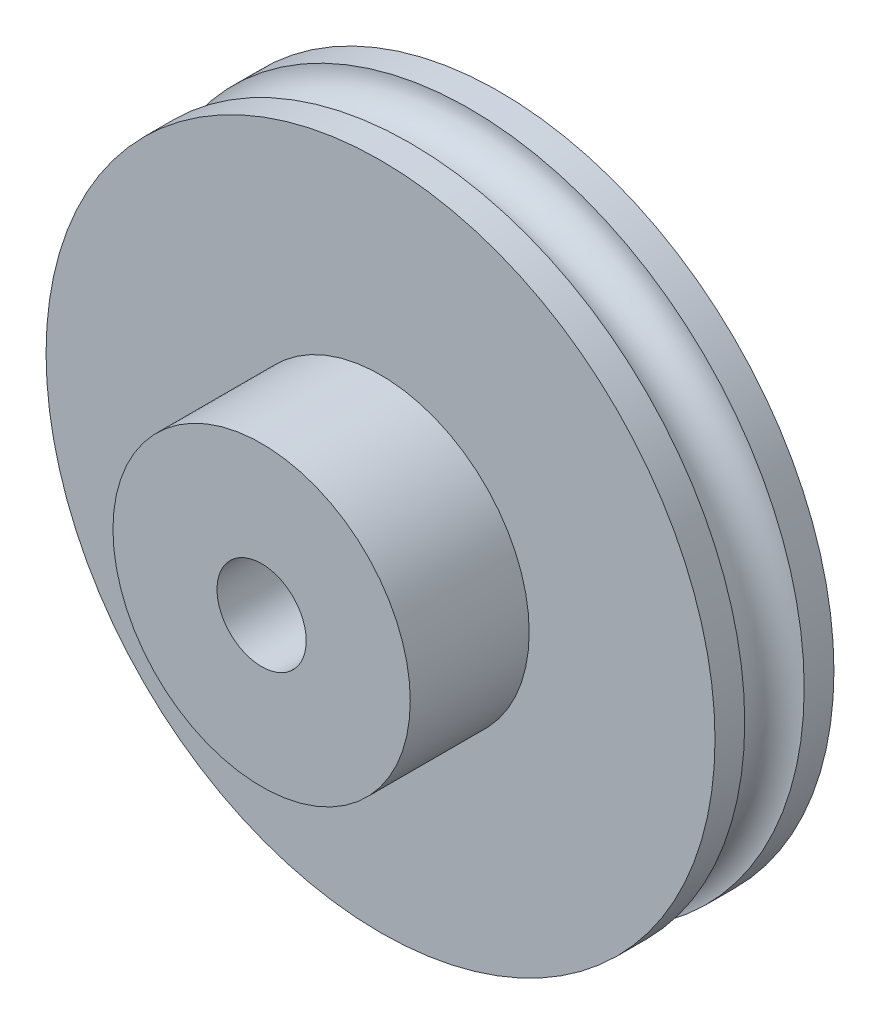
ISO-10303-21;
HEADER;
FILE_DESCRIPTION(('STEP AP214'),'2;1');
FILE_NAME('part.step','',(''),(''),'','','');
FILE_SCHEMA(('AUTOMOTIVE_DESIGN { 1 0 10303 214 1 1 1 1 }'));
ENDSEC;
DATA;
#1=APPLICATION_CONTEXT('core data for automotive mechanical design processes');
#2=APPLICATION_PROTOCOL_DEFINITION('international standard','automotive_design',2000,#1);
#3=PRODUCT_CONTEXT('',#1,'mechanical');
#4=PRODUCT('Part','Part','',(#3));
#5=PRODUCT_RELATED_PRODUCT_CATEGORY('part','',(#4));
#6=PRODUCT_DEFINITION_FORMATION('','',#4);
#7=PRODUCT_DEFINITION_CONTEXT('part definition',#1,'design');
#8=PRODUCT_DEFINITION('design','',#6,#7);
#9=PRODUCT_DEFINITION_SHAPE('','',#8);
#10=(LENGTH_UNIT() NAMED_UNIT(*) SI_UNIT(.MILLI.,.METRE.));
#11=(NAMED_UNIT(*) PLANE_ANGLE_UNIT() SI_UNIT($,.RADIAN.));
#12=(NAMED_UNIT(*) SI_UNIT($,.STERADIAN.) SOLID_ANGLE_UNIT());
#13=UNCERTAINTY_MEASURE_WITH_UNIT(LENGTH_MEASURE(1.E-05),#10,'distance_accuracy_value','');
#14=(GEOMETRIC_REPRESENTATION_CONTEXT(3) GLOBAL_UNCERTAINTY_ASSIGNED_CONTEXT((#13)) GLOBAL_UNIT_ASSIGNED_CONTEXT((#10,
#11,#12)) REPRESENTATION_CONTEXT('',''));
#15=CARTESIAN_POINT('',(0.,0.,0.));
#16=DIRECTION('',(0.,0.,1.));
#17=DIRECTION('',(1.,0.,0.));
#18=AXIS2_PLACEMENT_3D('',#15,#16,#17);
#19=CARTESIAN_POINT('',(0.,0.,8.));
#20=DIRECTION('',(0.,0.,-1.));
#21=DIRECTION('',(-1.,0.,0.));
#22=AXIS2_PLACEMENT_3D('',#19,#20,#21);
#23=CYLINDRICAL_SURFACE('',#22,22.5);
#24=CARTESIAN_POINT('',(0.,0.,8.));
#25=DIRECTION('',(0.,0.,1.));
#26=DIRECTION('',(1.,0.,0.));
#27=AXIS2_PLACEMENT_3D('',#24,#25,#26);
#28=CIRCLE('',#27,22.5);
#29=CARTESIAN_POINT('',(22.5,0.,8.));
#30=VERTEX_POINT('',#29);
#31=EDGE_CURVE('E45',#30,#30,#28,.T.);
#32=ORIENTED_EDGE('',*,*,#31,.F.);
#33=EDGE_LOOP('',(#32));
#34=FACE_BOUND('',#33,.T.);
#35=CARTESIAN_POINT('',(0.,0.,6.));
#36=DIRECTION('',(0.,0.,-1.));
#37=DIRECTION('',(-1.,0.,0.));
#38=AXIS2_PLACEMENT_3D('',#35,#36,#37);
#39=CIRCLE('',#38,22.5);
#40=CARTESIAN_POINT('',(-22.5,0.,6.));
#41=VERTEX_POINT('',#40);
#42=EDGE_CURVE('E41',#41,#41,#39,.T.);
#43=ORIENTED_EDGE('',*,*,#42,.F.);
#44=EDGE_LOOP('',(#43));
#45=FACE_BOUND('',#44,.T.);
#46=ADVANCED_FACE('F38',(#34,#45),#23,.T.);
#47=CARTESIAN_POINT('',(0.,0.,8.));
#48=DIRECTION('',(0.,0.,1.));
#49=DIRECTION('',(1.,0.,0.));
#50=AXIS2_PLACEMENT_3D('',#47,#48,#49);
#51=PLANE('',#50);
#52=CARTESIAN_POINT('',(0.,0.,8.));
#53=DIRECTION('',(0.,0.,1.));
#54=DIRECTION('',(1.,0.,0.));
#55=AXIS2_PLACEMENT_3D('',#52,#53,#54);
#56=CIRCLE('',#55,10.);
#57=CARTESIAN_POINT('',(10.,0.,8.));
#58=VERTEX_POINT('',#57);
#59=EDGE_CURVE('E10',#58,#58,#56,.T.);
#60=ORIENTED_EDGE('',*,*,#59,.F.);
#61=EDGE_LOOP('',(#60));
#62=FACE_BOUND('',#61,.T.);
#63=ORIENTED_EDGE('',*,*,#31,.T.);
#64=EDGE_LOOP('',(#63));
#65=FACE_BOUND('',#64,.T.);
#66=ADVANCED_FACE('F90',(#62,#65),#51,.T.);
#67=CARTESIAN_POINT('',(0.,0.,4.));
#68=DIRECTION('',(0.,0.,1.));
#69=DIRECTION('',(1.,0.,0.));
#70=AXIS2_PLACEMENT_3D('',#67,#68,#69);
#71=TOROIDAL_SURFACE('',#70,22.5,2.);
#72=CARTESIAN_POINT('',(0.,0.,2.));
#73=DIRECTION('',(0.,0.,1.));
#74=DIRECTION('',(1.,0.,0.));
#75=AXIS2_PLACEMENT_3D('',#72,#73,#74);
#76=CIRCLE('',#75,22.5);
#77=CARTESIAN_POINT('',(22.5,0.,2.));
#78=VERTEX_POINT('',#77);
#79=EDGE_CURVE('E57',#78,#78,#76,.T.);
#80=ORIENTED_EDGE('',*,*,#79,.T.);
#81=EDGE_LOOP('',(#80));
#82=FACE_BOUND('',#81,.T.);
#83=ORIENTED_EDGE('',*,*,#42,.T.);
#84=EDGE_LOOP('',(#83));
#85=FACE_BOUND('',#84,.T.);
#86=ADVANCED_FACE('F95',(#82,#85),#71,.F.);
#87=CARTESIAN_POINT('',(0.,0.,0.));
#88=DIRECTION('',(0.,0.,1.));
#89=DIRECTION('',(1.,0.,0.));
#90=AXIS2_PLACEMENT_3D('',#87,#88,#89);
#91=PLANE('',#90);
#92=CARTESIAN_POINT('',(0.,0.,0.));
#93=DIRECTION('',(0.,0.,1.));
#94=DIRECTION('',(1.,0.,0.));
#95=AXIS2_PLACEMENT_3D('',#92,#93,#94);
#96=CIRCLE('',#95,3.);
#97=CARTESIAN_POINT('',(3.,0.,0.));
#98=VERTEX_POINT('',#97);
#99=EDGE_CURVE('E63',#98,#98,#96,.T.);
#100=ORIENTED_EDGE('',*,*,#99,.T.);
#101=EDGE_LOOP('',(#100));
#102=FACE_BOUND('',#101,.T.);
#103=CARTESIAN_POINT('',(0.,0.,0.));
#104=DIRECTION('',(0.,0.,1.));
#105=DIRECTION('',(1.,0.,0.));
#106=AXIS2_PLACEMENT_3D('',#103,#104,#105);
#107=CIRCLE('',#106,22.5);
#108=CARTESIAN_POINT('',(22.5,0.,0.));
#109=VERTEX_POINT('',#108);
#110=EDGE_CURVE('E50',#109,#109,#107,.T.);
#111=ORIENTED_EDGE('',*,*,#110,.F.);
#112=EDGE_LOOP('',(#111));
#113=FACE_BOUND('',#112,.T.);
#114=ADVANCED_FACE('F101',(#102,#113),#91,.F.);
#115=ORIENTED_EDGE('',*,*,#110,.T.);
#116=EDGE_LOOP('',(#115));
#117=FACE_BOUND('',#116,.T.);
#118=ORIENTED_EDGE('',*,*,#79,.F.);
#119=EDGE_LOOP('',(#118));
#120=FACE_BOUND('',#119,.T.);
#121=ADVANCED_FACE('F86',(#117,#120),#23,.T.);
#122=CARTESIAN_POINT('',(0.,0.,16.));
#123=DIRECTION('',(0.,0.,-1.));
#124=DIRECTION('',(-1.,0.,0.));
#125=AXIS2_PLACEMENT_3D('',#122,#123,#124);
#126=CYLINDRICAL_SURFACE('',#125,10.);
#127=CARTESIAN_POINT('',(0.,0.,16.));
#128=DIRECTION('',(0.,0.,1.));
#129=DIRECTION('',(1.,0.,0.));
#130=AXIS2_PLACEMENT_3D('',#127,#128,#129);
#131=CIRCLE('',#130,10.);
#132=CARTESIAN_POINT('',(10.,0.,16.));
#133=VERTEX_POINT('',#132);
#134=EDGE_CURVE('E53',#133,#133,#131,.T.);
#135=ORIENTED_EDGE('',*,*,#134,.F.);
#136=EDGE_LOOP('',(#135));
#137=FACE_BOUND('',#136,.T.);
#138=ORIENTED_EDGE('',*,*,#59,.T.);
#139=EDGE_LOOP('',(#138));
#140=FACE_BOUND('',#139,.T.);
#141=ADVANCED_FACE('F78',(#137,#140),#126,.T.);
#142=CARTESIAN_POINT('',(0.,0.,16.));
#143=DIRECTION('',(0.,0.,1.));
#144=DIRECTION('',(1.,0.,0.));
#145=AXIS2_PLACEMENT_3D('',#142,#143,#144);
#146=PLANE('',#145);
#147=CARTESIAN_POINT('',(0.,0.,16.));
#148=DIRECTION('',(0.,0.,1.));
#149=DIRECTION('',(1.,0.,0.));
#150=AXIS2_PLACEMENT_3D('',#147,#148,#149);
#151=CIRCLE('',#150,3.);
#152=CARTESIAN_POINT('',(3.,0.,16.));
#153=VERTEX_POINT('',#152);
#154=EDGE_CURVE('E67',#153,#153,#151,.T.);
#155=ORIENTED_EDGE('',*,*,#154,.F.);
#156=EDGE_LOOP('',(#155));
#157=FACE_BOUND('',#156,.T.);
#158=ORIENTED_EDGE('',*,*,#134,.T.);
#159=EDGE_LOOP('',(#158));
#160=FACE_BOUND('',#159,.T.);
#161=ADVANCED_FACE('F76',(#157,#160),#146,.T.);
#162=CARTESIAN_POINT('',(0.,0.,0.));
#163=DIRECTION('',(0.,0.,1.));
#164=DIRECTION('',(1.,0.,0.));
#165=AXIS2_PLACEMENT_3D('',#162,#163,#164);
#166=CYLINDRICAL_SURFACE('',#165,3.);
#167=ORIENTED_EDGE('',*,*,#99,.F.);
#168=EDGE_LOOP('',(#167));
#169=FACE_BOUND('',#168,.T.);
#170=ORIENTED_EDGE('',*,*,#154,.T.);
#171=EDGE_LOOP('',(#170));
#172=FACE_BOUND('',#171,.T.);
#173=ADVANCED_FACE('F74',(#169,#172),#166,.F.);
#174=CLOSED_SHELL('',(#46,#66,#86,#114,#121,#141,#161,#173));
#175=MANIFOLD_SOLID_BREP('B2',#174);
#176=ADVANCED_BREP_SHAPE_REPRESENTATION('',(#18,#175),#14);
#177=SHAPE_DEFINITION_REPRESENTATION(#9,#176);
ENDSEC;
END-ISO-10303-21;
